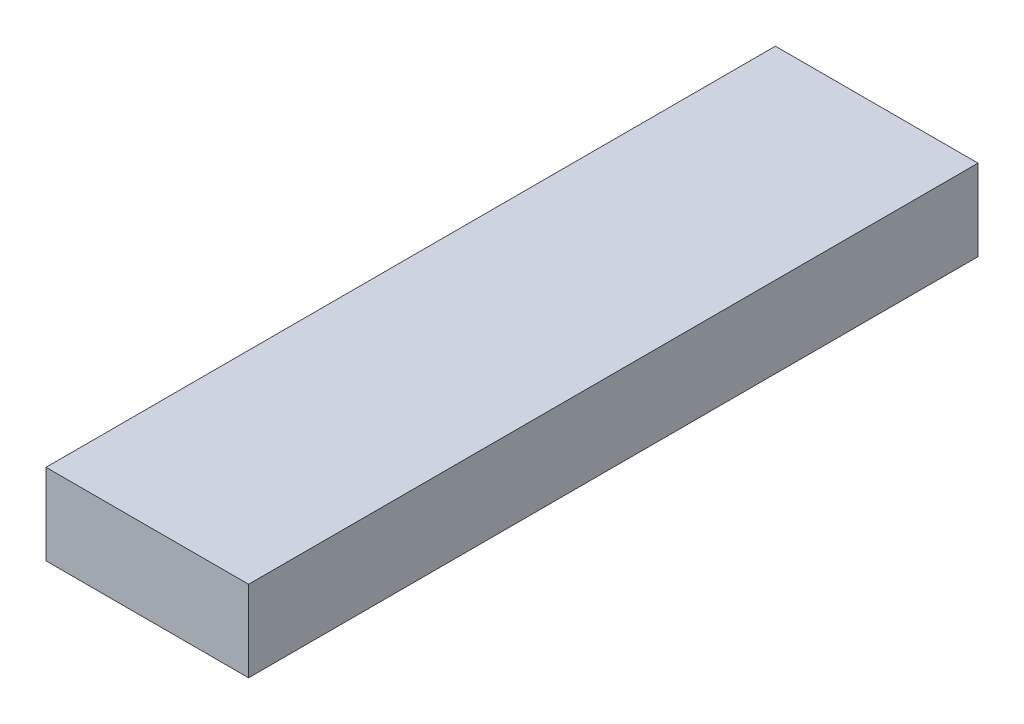
ISO-10303-21;
HEADER;
FILE_DESCRIPTION(('STEP AP214'),'2;1');
FILE_NAME('part.step','',(''),(''),'','','');
FILE_SCHEMA(('AUTOMOTIVE_DESIGN { 1 0 10303 214 1 1 1 1 }'));
ENDSEC;
DATA;
#1=APPLICATION_CONTEXT('core data for automotive mechanical design processes');
#2=APPLICATION_PROTOCOL_DEFINITION('international standard','automotive_design',2000,#1);
#3=PRODUCT_CONTEXT('',#1,'mechanical');
#4=PRODUCT('Part','Part','',(#3));
#5=PRODUCT_RELATED_PRODUCT_CATEGORY('part','',(#4));
#6=PRODUCT_DEFINITION_FORMATION('','',#4);
#7=PRODUCT_DEFINITION_CONTEXT('part definition',#1,'design');
#8=PRODUCT_DEFINITION('design','',#6,#7);
#9=PRODUCT_DEFINITION_SHAPE('','',#8);
#10=(LENGTH_UNIT() NAMED_UNIT(*) SI_UNIT(.MILLI.,.METRE.));
#11=(NAMED_UNIT(*) PLANE_ANGLE_UNIT() SI_UNIT($,.RADIAN.));
#12=(NAMED_UNIT(*) SI_UNIT($,.STERADIAN.) SOLID_ANGLE_UNIT());
#13=UNCERTAINTY_MEASURE_WITH_UNIT(LENGTH_MEASURE(1.E-05),#10,'distance_accuracy_value','');
#14=(GEOMETRIC_REPRESENTATION_CONTEXT(3) GLOBAL_UNCERTAINTY_ASSIGNED_CONTEXT((#13)) GLOBAL_UNIT_ASSIGNED_CONTEXT((#10,
#11,#12)) REPRESENTATION_CONTEXT('',''));
#15=CARTESIAN_POINT('',(0.,0.,0.));
#16=DIRECTION('',(0.,0.,1.));
#17=DIRECTION('',(1.,0.,0.));
#18=AXIS2_PLACEMENT_3D('',#15,#16,#17);
#19=CARTESIAN_POINT('',(25.,20.,90.));
#20=DIRECTION('',(-1.,0.,0.));
#21=DIRECTION('',(0.,0.,1.));
#22=AXIS2_PLACEMENT_3D('',#19,#20,#21);
#23=PLANE('',#22);
#24=DIRECTION('',(0.,0.,-1.));
#25=VECTOR('',#24,1.);
#26=CARTESIAN_POINT('',(25.,0.,90.));
#27=LINE('',#26,#25);
#28=CARTESIAN_POINT('',(25.,0.,90.));
#29=VERTEX_POINT('',#28);
#30=CARTESIAN_POINT('',(25.,0.,-90.));
#31=VERTEX_POINT('',#30);
#32=EDGE_CURVE('E96',#29,#31,#27,.T.);
#33=ORIENTED_EDGE('',*,*,#32,.T.);
#34=DIRECTION('',(0.,-1.,0.));
#35=VECTOR('',#34,1.);
#36=CARTESIAN_POINT('',(25.,20.,-90.));
#37=LINE('',#36,#35);
#38=CARTESIAN_POINT('',(25.,20.,-90.));
#39=VERTEX_POINT('',#38);
#40=EDGE_CURVE('E11',#39,#31,#37,.T.);
#41=ORIENTED_EDGE('',*,*,#40,.F.);
#42=DIRECTION('',(0.,0.,-1.));
#43=VECTOR('',#42,1.);
#44=CARTESIAN_POINT('',(25.,20.,90.));
#45=LINE('',#44,#43);
#46=CARTESIAN_POINT('',(25.,20.,90.));
#47=VERTEX_POINT('',#46);
#48=EDGE_CURVE('E84',#47,#39,#45,.T.);
#49=ORIENTED_EDGE('',*,*,#48,.F.);
#50=DIRECTION('',(0.,-1.,0.));
#51=VECTOR('',#50,1.);
#52=CARTESIAN_POINT('',(25.,20.,90.));
#53=LINE('',#52,#51);
#54=EDGE_CURVE('E92',#47,#29,#53,.T.);
#55=ORIENTED_EDGE('',*,*,#54,.T.);
#56=EDGE_LOOP('',(#33,#41,#49,#55));
#57=FACE_BOUND('',#56,.T.);
#58=ADVANCED_FACE('F33',(#57),#23,.F.);
#59=CARTESIAN_POINT('',(-25.,20.,-90.));
#60=DIRECTION('',(0.,0.,1.));
#61=DIRECTION('',(1.,0.,0.));
#62=AXIS2_PLACEMENT_3D('',#59,#60,#61);
#63=PLANE('',#62);
#64=DIRECTION('',(-1.,0.,0.));
#65=VECTOR('',#64,1.);
#66=CARTESIAN_POINT('',(-25.,0.,-90.));
#67=LINE('',#66,#65);
#68=CARTESIAN_POINT('',(-25.,0.,-90.));
#69=VERTEX_POINT('',#68);
#70=EDGE_CURVE('E88',#31,#69,#67,.T.);
#71=ORIENTED_EDGE('',*,*,#70,.T.);
#72=DIRECTION('',(0.,-1.,0.));
#73=VECTOR('',#72,1.);
#74=CARTESIAN_POINT('',(-25.,20.,-90.));
#75=LINE('',#74,#73);
#76=CARTESIAN_POINT('',(-25.,20.,-90.));
#77=VERTEX_POINT('',#76);
#78=EDGE_CURVE('E41',#77,#69,#75,.T.);
#79=ORIENTED_EDGE('',*,*,#78,.F.);
#80=DIRECTION('',(-1.,0.,0.));
#81=VECTOR('',#80,1.);
#82=CARTESIAN_POINT('',(-25.,20.,-90.));
#83=LINE('',#82,#81);
#84=EDGE_CURVE('E79',#39,#77,#83,.T.);
#85=ORIENTED_EDGE('',*,*,#84,.F.);
#86=ORIENTED_EDGE('',*,*,#40,.T.);
#87=EDGE_LOOP('',(#71,#79,#85,#86));
#88=FACE_BOUND('',#87,.T.);
#89=ADVANCED_FACE('F87',(#88),#63,.F.);
#90=CARTESIAN_POINT('',(-25.,20.,90.));
#91=DIRECTION('',(1.,0.,0.));
#92=DIRECTION('',(0.,0.,-1.));
#93=AXIS2_PLACEMENT_3D('',#90,#91,#92);
#94=PLANE('',#93);
#95=DIRECTION('',(0.,0.,1.));
#96=VECTOR('',#95,1.);
#97=CARTESIAN_POINT('',(-25.,0.,90.));
#98=LINE('',#97,#96);
#99=CARTESIAN_POINT('',(-25.,0.,90.));
#100=VERTEX_POINT('',#99);
#101=EDGE_CURVE('E66',#69,#100,#98,.T.);
#102=ORIENTED_EDGE('',*,*,#101,.T.);
#103=DIRECTION('',(0.,-1.,0.));
#104=VECTOR('',#103,1.);
#105=CARTESIAN_POINT('',(-25.,20.,90.));
#106=LINE('',#105,#104);
#107=CARTESIAN_POINT('',(-25.,20.,90.));
#108=VERTEX_POINT('',#107);
#109=EDGE_CURVE('E89',#108,#100,#106,.T.);
#110=ORIENTED_EDGE('',*,*,#109,.F.);
#111=DIRECTION('',(0.,0.,1.));
#112=VECTOR('',#111,1.);
#113=CARTESIAN_POINT('',(-25.,20.,90.));
#114=LINE('',#113,#112);
#115=EDGE_CURVE('E82',#77,#108,#114,.T.);
#116=ORIENTED_EDGE('',*,*,#115,.F.);
#117=ORIENTED_EDGE('',*,*,#78,.T.);
#118=EDGE_LOOP('',(#102,#110,#116,#117));
#119=FACE_BOUND('',#118,.T.);
#120=ADVANCED_FACE('F90',(#119),#94,.F.);
#121=CARTESIAN_POINT('',(-25.,20.,90.));
#122=DIRECTION('',(0.,0.,-1.));
#123=DIRECTION('',(-1.,0.,0.));
#124=AXIS2_PLACEMENT_3D('',#121,#122,#123);
#125=PLANE('',#124);
#126=DIRECTION('',(1.,0.,0.));
#127=VECTOR('',#126,1.);
#128=CARTESIAN_POINT('',(-25.,0.,90.));
#129=LINE('',#128,#127);
#130=EDGE_CURVE('E72',#100,#29,#129,.T.);
#131=ORIENTED_EDGE('',*,*,#130,.T.);
#132=ORIENTED_EDGE('',*,*,#54,.F.);
#133=DIRECTION('',(1.,0.,0.));
#134=VECTOR('',#133,1.);
#135=CARTESIAN_POINT('',(-25.,20.,90.));
#136=LINE('',#135,#134);
#137=EDGE_CURVE('E49',#108,#47,#136,.T.);
#138=ORIENTED_EDGE('',*,*,#137,.F.);
#139=ORIENTED_EDGE('',*,*,#109,.T.);
#140=EDGE_LOOP('',(#131,#132,#138,#139));
#141=FACE_BOUND('',#140,.T.);
#142=ADVANCED_FACE('F103',(#141),#125,.F.);
#143=CARTESIAN_POINT('',(0.,20.,0.));
#144=DIRECTION('',(0.,-1.,0.));
#145=DIRECTION('',(0.,0.,-1.));
#146=AXIS2_PLACEMENT_3D('',#143,#144,#145);
#147=PLANE('',#146);
#148=ORIENTED_EDGE('',*,*,#48,.T.);
#149=ORIENTED_EDGE('',*,*,#84,.T.);
#150=ORIENTED_EDGE('',*,*,#115,.T.);
#151=ORIENTED_EDGE('',*,*,#137,.T.);
#152=EDGE_LOOP('',(#148,#149,#150,#151));
#153=FACE_BOUND('',#152,.T.);
#154=ADVANCED_FACE('F80',(#153),#147,.F.);
#155=CARTESIAN_POINT('',(0.,0.,0.));
#156=DIRECTION('',(0.,-1.,0.));
#157=DIRECTION('',(0.,0.,-1.));
#158=AXIS2_PLACEMENT_3D('',#155,#156,#157);
#159=PLANE('',#158);
#160=ORIENTED_EDGE('',*,*,#32,.F.);
#161=ORIENTED_EDGE('',*,*,#130,.F.);
#162=ORIENTED_EDGE('',*,*,#101,.F.);
#163=ORIENTED_EDGE('',*,*,#70,.F.);
#164=EDGE_LOOP('',(#160,#161,#162,#163));
#165=FACE_BOUND('',#164,.T.);
#166=ADVANCED_FACE('F106',(#165),#159,.T.);
#167=CLOSED_SHELL('',(#58,#89,#120,#142,#154,#166));
#168=MANIFOLD_SOLID_BREP('B2',#167);
#169=ADVANCED_BREP_SHAPE_REPRESENTATION('',(#18,#168),#14);
#170=SHAPE_DEFINITION_REPRESENTATION(#9,#169);
ENDSEC;
END-ISO-10303-21;
